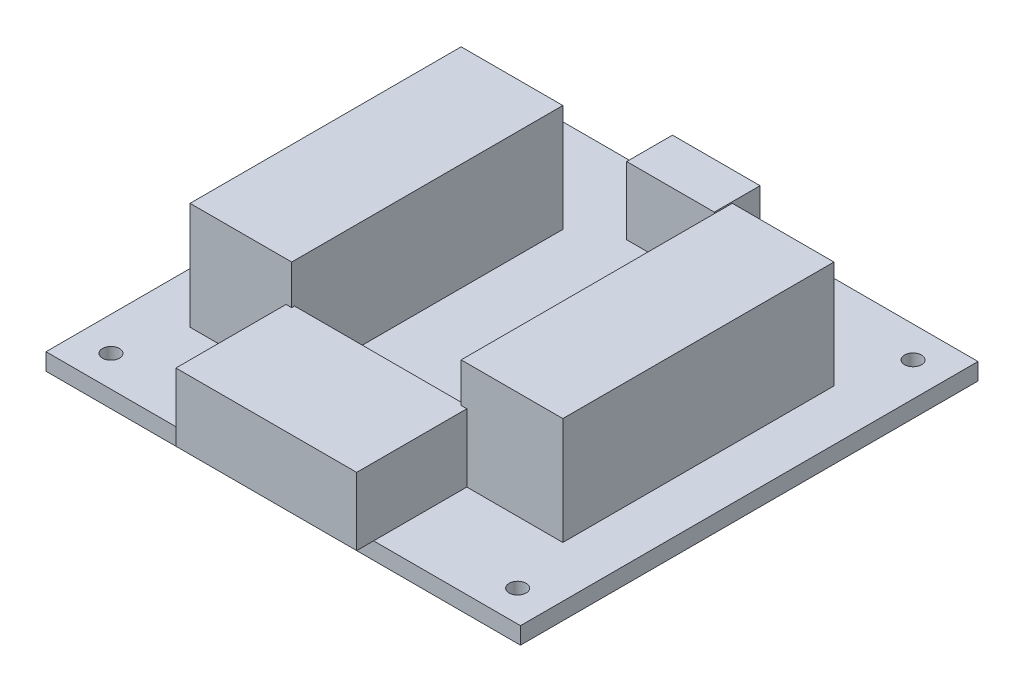
ISO-10303-21;
HEADER;
FILE_DESCRIPTION(('STEP AP214'),'2;1');
FILE_NAME('part.step','',(''),(''),'','','');
FILE_SCHEMA(('AUTOMOTIVE_DESIGN { 1 0 10303 214 1 1 1 1 }'));
ENDSEC;
DATA;
#1=APPLICATION_CONTEXT('core data for automotive mechanical design processes');
#2=APPLICATION_PROTOCOL_DEFINITION('international standard','automotive_design',2000,#1);
#3=PRODUCT_CONTEXT('',#1,'mechanical');
#4=PRODUCT('Part','Part','',(#3));
#5=PRODUCT_RELATED_PRODUCT_CATEGORY('part','',(#4));
#6=PRODUCT_DEFINITION_FORMATION('','',#4);
#7=PRODUCT_DEFINITION_CONTEXT('part definition',#1,'design');
#8=PRODUCT_DEFINITION('design','',#6,#7);
#9=PRODUCT_DEFINITION_SHAPE('','',#8);
#10=(LENGTH_UNIT() NAMED_UNIT(*) SI_UNIT(.MILLI.,.METRE.));
#11=(NAMED_UNIT(*) PLANE_ANGLE_UNIT() SI_UNIT($,.RADIAN.));
#12=(NAMED_UNIT(*) SI_UNIT($,.STERADIAN.) SOLID_ANGLE_UNIT());
#13=UNCERTAINTY_MEASURE_WITH_UNIT(LENGTH_MEASURE(1.E-05),#10,'distance_accuracy_value','');
#14=(GEOMETRIC_REPRESENTATION_CONTEXT(3) GLOBAL_UNCERTAINTY_ASSIGNED_CONTEXT((#13)) GLOBAL_UNIT_ASSIGNED_CONTEXT((#10,
#11,#12)) REPRESENTATION_CONTEXT('',''));
#15=CARTESIAN_POINT('',(0.,0.,0.));
#16=DIRECTION('',(0.,0.,1.));
#17=DIRECTION('',(1.,0.,0.));
#18=AXIS2_PLACEMENT_3D('',#15,#16,#17);
#19=CARTESIAN_POINT('',(0.,3.,0.));
#20=DIRECTION('',(0.,1.,0.));
#21=DIRECTION('',(0.,0.,1.));
#22=AXIS2_PLACEMENT_3D('',#19,#20,#21);
#23=PLANE('',#22);
#24=CARTESIAN_POINT('',(-36.,3.,35.));
#25=DIRECTION('',(0.,1.,0.));
#26=DIRECTION('',(0.,0.,1.));
#27=AXIS2_PLACEMENT_3D('',#24,#25,#26);
#28=CIRCLE('',#27,1.5);
#29=CARTESIAN_POINT('',(-36.,3.,36.5));
#30=VERTEX_POINT('',#29);
#31=EDGE_CURVE('E373',#30,#30,#28,.T.);
#32=ORIENTED_EDGE('',*,*,#31,.F.);
#33=EDGE_LOOP('',(#32));
#34=FACE_BOUND('',#33,.T.);
#35=CARTESIAN_POINT('',(36.,3.,-35.));
#36=DIRECTION('',(0.,1.,0.));
#37=DIRECTION('',(0.,0.,1.));
#38=AXIS2_PLACEMENT_3D('',#35,#36,#37);
#39=CIRCLE('',#38,1.5);
#40=CARTESIAN_POINT('',(36.,3.,-33.5));
#41=VERTEX_POINT('',#40);
#42=EDGE_CURVE('E363',#41,#41,#39,.T.);
#43=ORIENTED_EDGE('',*,*,#42,.F.);
#44=EDGE_LOOP('',(#43));
#45=FACE_BOUND('',#44,.T.);
#46=CARTESIAN_POINT('',(36.,3.,35.));
#47=DIRECTION('',(0.,1.,0.));
#48=DIRECTION('',(0.,0.,1.));
#49=AXIS2_PLACEMENT_3D('',#46,#47,#48);
#50=CIRCLE('',#49,1.5);
#51=CARTESIAN_POINT('',(36.,3.,36.5));
#52=VERTEX_POINT('',#51);
#53=EDGE_CURVE('E360',#52,#52,#50,.T.);
#54=ORIENTED_EDGE('',*,*,#53,.F.);
#55=EDGE_LOOP('',(#54));
#56=FACE_BOUND('',#55,.T.);
#57=CARTESIAN_POINT('',(-36.,3.,-35.));
#58=DIRECTION('',(0.,1.,0.));
#59=DIRECTION('',(0.,0.,1.));
#60=AXIS2_PLACEMENT_3D('',#57,#58,#59);
#61=CIRCLE('',#60,1.5);
#62=CARTESIAN_POINT('',(-36.,3.,-33.5));
#63=VERTEX_POINT('',#62);
#64=EDGE_CURVE('E357',#63,#63,#61,.T.);
#65=ORIENTED_EDGE('',*,*,#64,.F.);
#66=EDGE_LOOP('',(#65));
#67=FACE_BOUND('',#66,.T.);
#68=DIRECTION('',(1.,0.,0.));
#69=VECTOR('',#68,1.);
#70=CARTESIAN_POINT('',(33.,3.,24.));
#71=LINE('',#70,#69);
#72=CARTESIAN_POINT('',(16.,3.,24.));
#73=VERTEX_POINT('',#72);
#74=CARTESIAN_POINT('',(33.,3.,24.));
#75=VERTEX_POINT('',#74);
#76=EDGE_CURVE('E261',#73,#75,#71,.T.);
#77=ORIENTED_EDGE('',*,*,#76,.F.);
#78=DIRECTION('',(0.,0.,-1.));
#79=VECTOR('',#78,1.);
#80=CARTESIAN_POINT('',(16.,3.,23.5));
#81=LINE('',#80,#79);
#82=CARTESIAN_POINT('',(16.,3.,40.5));
#83=VERTEX_POINT('',#82);
#84=EDGE_CURVE('E214',#83,#73,#81,.T.);
#85=ORIENTED_EDGE('',*,*,#84,.F.);
#86=DIRECTION('',(1.,0.,0.));
#87=VECTOR('',#86,1.);
#88=CARTESIAN_POINT('',(-42.,3.,40.5));
#89=LINE('',#88,#87);
#90=CARTESIAN_POINT('',(42.,3.,40.5));
#91=VERTEX_POINT('',#90);
#92=EDGE_CURVE('E325',#83,#91,#89,.T.);
#93=ORIENTED_EDGE('',*,*,#92,.T.);
#94=DIRECTION('',(0.,0.,-1.));
#95=VECTOR('',#94,1.);
#96=CARTESIAN_POINT('',(42.,3.,-40.5));
#97=LINE('',#96,#95);
#98=CARTESIAN_POINT('',(42.,3.,-40.5));
#99=VERTEX_POINT('',#98);
#100=EDGE_CURVE('E317',#91,#99,#97,.T.);
#101=ORIENTED_EDGE('',*,*,#100,.T.);
#102=DIRECTION('',(-1.,0.,0.));
#103=VECTOR('',#102,1.);
#104=CARTESIAN_POINT('',(-42.,3.,-40.5));
#105=LINE('',#104,#103);
#106=CARTESIAN_POINT('',(-42.,3.,-40.5));
#107=VERTEX_POINT('',#106);
#108=EDGE_CURVE('E320',#99,#107,#105,.T.);
#109=ORIENTED_EDGE('',*,*,#108,.T.);
#110=DIRECTION('',(0.,0.,1.));
#111=VECTOR('',#110,1.);
#112=CARTESIAN_POINT('',(-42.,3.,-40.5));
#113=LINE('',#112,#111);
#114=CARTESIAN_POINT('',(-42.,3.,40.5));
#115=VERTEX_POINT('',#114);
#116=EDGE_CURVE('E323',#107,#115,#113,.T.);
#117=ORIENTED_EDGE('',*,*,#116,.T.);
#118=CARTESIAN_POINT('',(-16.,3.,40.5));
#119=VERTEX_POINT('',#118);
#120=EDGE_CURVE('E326',#115,#119,#89,.T.);
#121=ORIENTED_EDGE('',*,*,#120,.T.);
#122=DIRECTION('',(0.,0.,1.));
#123=VECTOR('',#122,1.);
#124=CARTESIAN_POINT('',(-16.,3.,23.5));
#125=LINE('',#124,#123);
#126=CARTESIAN_POINT('',(-16.,3.,24.));
#127=VERTEX_POINT('',#126);
#128=EDGE_CURVE('E236',#127,#119,#125,.T.);
#129=ORIENTED_EDGE('',*,*,#128,.F.);
#130=DIRECTION('',(1.,0.,0.));
#131=VECTOR('',#130,1.);
#132=CARTESIAN_POINT('',(-33.,3.,24.));
#133=LINE('',#132,#131);
#134=CARTESIAN_POINT('',(-33.,3.,24.));
#135=VERTEX_POINT('',#134);
#136=EDGE_CURVE('E291',#135,#127,#133,.T.);
#137=ORIENTED_EDGE('',*,*,#136,.F.);
#138=DIRECTION('',(0.,0.,1.));
#139=VECTOR('',#138,1.);
#140=CARTESIAN_POINT('',(-33.,3.,-24.));
#141=LINE('',#140,#139);
#142=CARTESIAN_POINT('',(-33.,3.,-24.));
#143=VERTEX_POINT('',#142);
#144=EDGE_CURVE('E301',#143,#135,#141,.T.);
#145=ORIENTED_EDGE('',*,*,#144,.F.);
#146=DIRECTION('',(-1.,0.,0.));
#147=VECTOR('',#146,1.);
#148=CARTESIAN_POINT('',(-33.,3.,-24.));
#149=LINE('',#148,#147);
#150=CARTESIAN_POINT('',(-15.,3.,-24.));
#151=VERTEX_POINT('',#150);
#152=EDGE_CURVE('E299',#151,#143,#149,.T.);
#153=ORIENTED_EDGE('',*,*,#152,.F.);
#154=DIRECTION('',(0.,0.,-1.));
#155=VECTOR('',#154,1.);
#156=CARTESIAN_POINT('',(-15.,3.,-24.));
#157=LINE('',#156,#155);
#158=CARTESIAN_POINT('',(-15.,3.,23.5));
#159=VERTEX_POINT('',#158);
#160=EDGE_CURVE('E286',#159,#151,#157,.T.);
#161=ORIENTED_EDGE('',*,*,#160,.F.);
#162=DIRECTION('',(-1.,0.,0.));
#163=VECTOR('',#162,1.);
#164=CARTESIAN_POINT('',(-16.,3.,23.5));
#165=LINE('',#164,#163);
#166=CARTESIAN_POINT('',(15.,3.,23.5));
#167=VERTEX_POINT('',#166);
#168=EDGE_CURVE('E232',#167,#159,#165,.T.);
#169=ORIENTED_EDGE('',*,*,#168,.F.);
#170=DIRECTION('',(0.,0.,1.));
#171=VECTOR('',#170,1.);
#172=CARTESIAN_POINT('',(15.,3.,-24.));
#173=LINE('',#172,#171);
#174=CARTESIAN_POINT('',(15.,3.,-24.));
#175=VERTEX_POINT('',#174);
#176=EDGE_CURVE('E272',#175,#167,#173,.T.);
#177=ORIENTED_EDGE('',*,*,#176,.F.);
#178=DIRECTION('',(-1.,0.,0.));
#179=VECTOR('',#178,1.);
#180=CARTESIAN_POINT('',(33.,3.,-24.));
#181=LINE('',#180,#179);
#182=CARTESIAN_POINT('',(33.,3.,-24.));
#183=VERTEX_POINT('',#182);
#184=EDGE_CURVE('E270',#183,#175,#181,.T.);
#185=ORIENTED_EDGE('',*,*,#184,.F.);
#186=DIRECTION('',(0.,0.,-1.));
#187=VECTOR('',#186,1.);
#188=CARTESIAN_POINT('',(33.,3.,-24.));
#189=LINE('',#188,#187);
#190=EDGE_CURVE('E256',#75,#183,#189,.T.);
#191=ORIENTED_EDGE('',*,*,#190,.F.);
#192=EDGE_LOOP('',(#77,#85,#93,#101,#109,#117,#121,#129,#137,#145,#153,#161,#169,#177,#185,#191));
#193=FACE_BOUND('',#192,.T.);
#194=DIRECTION('',(-1.,0.,0.));
#195=VECTOR('',#194,1.);
#196=CARTESIAN_POINT('',(-7.75353526251993,3.,-36.1638771572757));
#197=LINE('',#196,#195);
#198=CARTESIAN_POINT('',(7.75353526251993,3.,-36.1638771572757));
#199=VERTEX_POINT('',#198);
#200=CARTESIAN_POINT('',(-7.75353526251993,3.,-36.1638771572757));
#201=VERTEX_POINT('',#200);
#202=EDGE_CURVE('E382',#199,#201,#197,.T.);
#203=ORIENTED_EDGE('',*,*,#202,.F.);
#204=DIRECTION('',(0.,0.,-1.));
#205=VECTOR('',#204,1.);
#206=CARTESIAN_POINT('',(7.75353526251993,3.,-36.1638771572757));
#207=LINE('',#206,#205);
#208=CARTESIAN_POINT('',(7.75353526251993,3.,-28.063168674046));
#209=VERTEX_POINT('',#208);
#210=EDGE_CURVE('E212',#209,#199,#207,.T.);
#211=ORIENTED_EDGE('',*,*,#210,.F.);
#212=DIRECTION('',(1.,0.,0.));
#213=VECTOR('',#212,1.);
#214=CARTESIAN_POINT('',(-7.75353526251993,3.,-28.063168674046));
#215=LINE('',#214,#213);
#216=CARTESIAN_POINT('',(-7.75353526251993,3.,-28.063168674046));
#217=VERTEX_POINT('',#216);
#218=EDGE_CURVE('E208',#217,#209,#215,.T.);
#219=ORIENTED_EDGE('',*,*,#218,.F.);
#220=DIRECTION('',(0.,0.,1.));
#221=VECTOR('',#220,1.);
#222=CARTESIAN_POINT('',(-7.75353526251993,3.,-36.1638771572757));
#223=LINE('',#222,#221);
#224=EDGE_CURVE('E384',#201,#217,#223,.T.);
#225=ORIENTED_EDGE('',*,*,#224,.F.);
#226=EDGE_LOOP('',(#203,#211,#219,#225));
#227=FACE_BOUND('',#226,.T.);
#228=ADVANCED_FACE('F33',(#34,#45,#56,#67,#193,#227),#23,.T.);
#229=CARTESIAN_POINT('',(-15.,22.,-24.));
#230=DIRECTION('',(-1.,0.,0.));
#231=DIRECTION('',(0.,0.,1.));
#232=AXIS2_PLACEMENT_3D('',#229,#230,#231);
#233=PLANE('',#232);
#234=DIRECTION('',(0.,1.,0.));
#235=VECTOR('',#234,1.);
#236=CARTESIAN_POINT('',(-15.,22.,23.5));
#237=LINE('',#236,#235);
#238=CARTESIAN_POINT('',(-15.,15.,23.5));
#239=VERTEX_POINT('',#238);
#240=EDGE_CURVE('E254',#159,#239,#237,.T.);
#241=ORIENTED_EDGE('',*,*,#240,.F.);
#242=ORIENTED_EDGE('',*,*,#160,.T.);
#243=DIRECTION('',(0.,-1.,0.));
#244=VECTOR('',#243,1.);
#245=CARTESIAN_POINT('',(-15.,22.,-24.));
#246=LINE('',#245,#244);
#247=CARTESIAN_POINT('',(-15.,22.,-24.));
#248=VERTEX_POINT('',#247);
#249=EDGE_CURVE('E313',#248,#151,#246,.T.);
#250=ORIENTED_EDGE('',*,*,#249,.F.);
#251=DIRECTION('',(0.,0.,-1.));
#252=VECTOR('',#251,1.);
#253=CARTESIAN_POINT('',(-15.,22.,-24.));
#254=LINE('',#253,#252);
#255=CARTESIAN_POINT('',(-15.,22.,24.));
#256=VERTEX_POINT('',#255);
#257=EDGE_CURVE('E287',#256,#248,#254,.T.);
#258=ORIENTED_EDGE('',*,*,#257,.F.);
#259=DIRECTION('',(0.,-1.,0.));
#260=VECTOR('',#259,1.);
#261=CARTESIAN_POINT('',(-15.,22.,24.));
#262=LINE('',#261,#260);
#263=CARTESIAN_POINT('',(-15.,15.,24.));
#264=VERTEX_POINT('',#263);
#265=EDGE_CURVE('E297',#256,#264,#262,.T.);
#266=ORIENTED_EDGE('',*,*,#265,.T.);
#267=DIRECTION('',(0.,0.,-1.));
#268=VECTOR('',#267,1.);
#269=CARTESIAN_POINT('',(-15.,15.,-24.));
#270=LINE('',#269,#268);
#271=EDGE_CURVE('E251',#264,#239,#270,.T.);
#272=ORIENTED_EDGE('',*,*,#271,.T.);
#273=EDGE_LOOP('',(#241,#242,#250,#258,#266,#272));
#274=FACE_BOUND('',#273,.T.);
#275=ADVANCED_FACE('F403',(#274),#233,.F.);
#276=CARTESIAN_POINT('',(-33.,22.,24.));
#277=DIRECTION('',(0.,0.,-1.));
#278=DIRECTION('',(-1.,0.,0.));
#279=AXIS2_PLACEMENT_3D('',#276,#277,#278);
#280=PLANE('',#279);
#281=DIRECTION('',(0.,-1.,0.));
#282=VECTOR('',#281,1.);
#283=CARTESIAN_POINT('',(-16.,22.,24.));
#284=LINE('',#283,#282);
#285=CARTESIAN_POINT('',(-16.,15.,24.));
#286=VERTEX_POINT('',#285);
#287=EDGE_CURVE('E11',#286,#127,#284,.T.);
#288=ORIENTED_EDGE('',*,*,#287,.F.);
#289=DIRECTION('',(1.,0.,0.));
#290=VECTOR('',#289,1.);
#291=CARTESIAN_POINT('',(-33.,15.,24.));
#292=LINE('',#291,#290);
#293=EDGE_CURVE('E248',#286,#264,#292,.T.);
#294=ORIENTED_EDGE('',*,*,#293,.T.);
#295=ORIENTED_EDGE('',*,*,#265,.F.);
#296=DIRECTION('',(1.,0.,0.));
#297=VECTOR('',#296,1.);
#298=CARTESIAN_POINT('',(-33.,22.,24.));
#299=LINE('',#298,#297);
#300=CARTESIAN_POINT('',(-33.,22.,24.));
#301=VERTEX_POINT('',#300);
#302=EDGE_CURVE('E295',#301,#256,#299,.T.);
#303=ORIENTED_EDGE('',*,*,#302,.F.);
#304=DIRECTION('',(0.,-1.,0.));
#305=VECTOR('',#304,1.);
#306=CARTESIAN_POINT('',(-33.,22.,24.));
#307=LINE('',#306,#305);
#308=EDGE_CURVE('E308',#301,#135,#307,.T.);
#309=ORIENTED_EDGE('',*,*,#308,.T.);
#310=ORIENTED_EDGE('',*,*,#136,.T.);
#311=EDGE_LOOP('',(#288,#294,#295,#303,#309,#310));
#312=FACE_BOUND('',#311,.T.);
#313=ADVANCED_FACE('F409',(#312),#280,.F.);
#314=CARTESIAN_POINT('',(15.,22.,-24.));
#315=DIRECTION('',(1.,0.,0.));
#316=DIRECTION('',(0.,0.,-1.));
#317=AXIS2_PLACEMENT_3D('',#314,#315,#316);
#318=PLANE('',#317);
#319=DIRECTION('',(0.,-1.,0.));
#320=VECTOR('',#319,1.);
#321=CARTESIAN_POINT('',(15.,22.,23.5));
#322=LINE('',#321,#320);
#323=CARTESIAN_POINT('',(15.,15.,23.5));
#324=VERTEX_POINT('',#323);
#325=EDGE_CURVE('E42',#324,#167,#322,.T.);
#326=ORIENTED_EDGE('',*,*,#325,.F.);
#327=DIRECTION('',(0.,0.,1.));
#328=VECTOR('',#327,1.);
#329=CARTESIAN_POINT('',(15.,15.,-24.));
#330=LINE('',#329,#328);
#331=CARTESIAN_POINT('',(15.,15.,24.));
#332=VERTEX_POINT('',#331);
#333=EDGE_CURVE('E245',#324,#332,#330,.T.);
#334=ORIENTED_EDGE('',*,*,#333,.T.);
#335=DIRECTION('',(0.,-1.,0.));
#336=VECTOR('',#335,1.);
#337=CARTESIAN_POINT('',(15.,22.,24.));
#338=LINE('',#337,#336);
#339=CARTESIAN_POINT('',(15.,22.,24.));
#340=VERTEX_POINT('',#339);
#341=EDGE_CURVE('E278',#340,#332,#338,.T.);
#342=ORIENTED_EDGE('',*,*,#341,.F.);
#343=DIRECTION('',(0.,0.,1.));
#344=VECTOR('',#343,1.);
#345=CARTESIAN_POINT('',(15.,22.,-24.));
#346=LINE('',#345,#344);
#347=CARTESIAN_POINT('',(15.,22.,-24.));
#348=VERTEX_POINT('',#347);
#349=EDGE_CURVE('E263',#348,#340,#346,.T.);
#350=ORIENTED_EDGE('',*,*,#349,.F.);
#351=DIRECTION('',(0.,-1.,0.));
#352=VECTOR('',#351,1.);
#353=CARTESIAN_POINT('',(15.,22.,-24.));
#354=LINE('',#353,#352);
#355=EDGE_CURVE('E281',#348,#175,#354,.T.);
#356=ORIENTED_EDGE('',*,*,#355,.T.);
#357=ORIENTED_EDGE('',*,*,#176,.T.);
#358=EDGE_LOOP('',(#326,#334,#342,#350,#356,#357));
#359=FACE_BOUND('',#358,.T.);
#360=ADVANCED_FACE('F482',(#359),#318,.F.);
#361=CARTESIAN_POINT('',(33.,22.,24.));
#362=DIRECTION('',(0.,0.,-1.));
#363=DIRECTION('',(-1.,0.,0.));
#364=AXIS2_PLACEMENT_3D('',#361,#362,#363);
#365=PLANE('',#364);
#366=DIRECTION('',(0.,1.,0.));
#367=VECTOR('',#366,1.);
#368=CARTESIAN_POINT('',(16.,22.,24.));
#369=LINE('',#368,#367);
#370=CARTESIAN_POINT('',(16.,15.,24.));
#371=VERTEX_POINT('',#370);
#372=EDGE_CURVE('E351',#73,#371,#369,.T.);
#373=ORIENTED_EDGE('',*,*,#372,.F.);
#374=ORIENTED_EDGE('',*,*,#76,.T.);
#375=DIRECTION('',(0.,-1.,0.));
#376=VECTOR('',#375,1.);
#377=CARTESIAN_POINT('',(33.,22.,24.));
#378=LINE('',#377,#376);
#379=CARTESIAN_POINT('',(33.,22.,24.));
#380=VERTEX_POINT('',#379);
#381=EDGE_CURVE('E267',#380,#75,#378,.T.);
#382=ORIENTED_EDGE('',*,*,#381,.F.);
#383=DIRECTION('',(1.,0.,0.));
#384=VECTOR('',#383,1.);
#385=CARTESIAN_POINT('',(33.,22.,24.));
#386=LINE('',#385,#384);
#387=EDGE_CURVE('E265',#340,#380,#386,.T.);
#388=ORIENTED_EDGE('',*,*,#387,.F.);
#389=ORIENTED_EDGE('',*,*,#341,.T.);
#390=DIRECTION('',(1.,0.,0.));
#391=VECTOR('',#390,1.);
#392=CARTESIAN_POINT('',(33.,15.,24.));
#393=LINE('',#392,#391);
#394=EDGE_CURVE('E348',#332,#371,#393,.T.);
#395=ORIENTED_EDGE('',*,*,#394,.T.);
#396=EDGE_LOOP('',(#373,#374,#382,#388,#389,#395));
#397=FACE_BOUND('',#396,.T.);
#398=ADVANCED_FACE('F434',(#397),#365,.F.);
#399=CARTESIAN_POINT('',(42.,3.,-40.5));
#400=DIRECTION('',(-1.,0.,0.));
#401=DIRECTION('',(0.,0.,1.));
#402=AXIS2_PLACEMENT_3D('',#399,#400,#401);
#403=PLANE('',#402);
#404=DIRECTION('',(0.,0.,-1.));
#405=VECTOR('',#404,1.);
#406=CARTESIAN_POINT('',(42.,0.,-40.5));
#407=LINE('',#406,#405);
#408=CARTESIAN_POINT('',(42.,0.,40.5));
#409=VERTEX_POINT('',#408);
#410=CARTESIAN_POINT('',(42.,0.,-40.5));
#411=VERTEX_POINT('',#410);
#412=EDGE_CURVE('E316',#409,#411,#407,.T.);
#413=ORIENTED_EDGE('',*,*,#412,.T.);
#414=DIRECTION('',(0.,-1.,0.));
#415=VECTOR('',#414,1.);
#416=CARTESIAN_POINT('',(42.,3.,-40.5));
#417=LINE('',#416,#415);
#418=EDGE_CURVE('E345',#99,#411,#417,.T.);
#419=ORIENTED_EDGE('',*,*,#418,.F.);
#420=ORIENTED_EDGE('',*,*,#100,.F.);
#421=DIRECTION('',(0.,-1.,0.));
#422=VECTOR('',#421,1.);
#423=CARTESIAN_POINT('',(42.,3.,40.5));
#424=LINE('',#423,#422);
#425=EDGE_CURVE('E329',#91,#409,#424,.T.);
#426=ORIENTED_EDGE('',*,*,#425,.T.);
#427=EDGE_LOOP('',(#413,#419,#420,#426));
#428=FACE_BOUND('',#427,.T.);
#429=ADVANCED_FACE('F35',(#428),#403,.F.);
#430=CARTESIAN_POINT('',(-42.,3.,-40.5));
#431=DIRECTION('',(0.,0.,1.));
#432=DIRECTION('',(1.,0.,0.));
#433=AXIS2_PLACEMENT_3D('',#430,#431,#432);
#434=PLANE('',#433);
#435=DIRECTION('',(-1.,0.,0.));
#436=VECTOR('',#435,1.);
#437=CARTESIAN_POINT('',(-42.,0.,-40.5));
#438=LINE('',#437,#436);
#439=CARTESIAN_POINT('',(-42.,0.,-40.5));
#440=VERTEX_POINT('',#439);
#441=EDGE_CURVE('E332',#411,#440,#438,.T.);
#442=ORIENTED_EDGE('',*,*,#441,.T.);
#443=DIRECTION('',(0.,-1.,0.));
#444=VECTOR('',#443,1.);
#445=CARTESIAN_POINT('',(-42.,3.,-40.5));
#446=LINE('',#445,#444);
#447=EDGE_CURVE('E342',#107,#440,#446,.T.);
#448=ORIENTED_EDGE('',*,*,#447,.F.);
#449=ORIENTED_EDGE('',*,*,#108,.F.);
#450=ORIENTED_EDGE('',*,*,#418,.T.);
#451=EDGE_LOOP('',(#442,#448,#449,#450));
#452=FACE_BOUND('',#451,.T.);
#453=ADVANCED_FACE('F427',(#452),#434,.F.);
#454=CARTESIAN_POINT('',(-42.,3.,-40.5));
#455=DIRECTION('',(1.,0.,0.));
#456=DIRECTION('',(0.,0.,-1.));
#457=AXIS2_PLACEMENT_3D('',#454,#455,#456);
#458=PLANE('',#457);
#459=DIRECTION('',(0.,0.,1.));
#460=VECTOR('',#459,1.);
#461=CARTESIAN_POINT('',(-42.,0.,-40.5));
#462=LINE('',#461,#460);
#463=CARTESIAN_POINT('',(-42.,0.,40.5));
#464=VERTEX_POINT('',#463);
#465=EDGE_CURVE('E334',#440,#464,#462,.T.);
#466=ORIENTED_EDGE('',*,*,#465,.T.);
#467=DIRECTION('',(0.,-1.,0.));
#468=VECTOR('',#467,1.);
#469=CARTESIAN_POINT('',(-42.,3.,40.5));
#470=LINE('',#469,#468);
#471=EDGE_CURVE('E339',#115,#464,#470,.T.);
#472=ORIENTED_EDGE('',*,*,#471,.F.);
#473=ORIENTED_EDGE('',*,*,#116,.F.);
#474=ORIENTED_EDGE('',*,*,#447,.T.);
#475=EDGE_LOOP('',(#466,#472,#473,#474));
#476=FACE_BOUND('',#475,.T.);
#477=ADVANCED_FACE('F424',(#476),#458,.F.);
#478=CARTESIAN_POINT('',(-42.,3.,40.5));
#479=DIRECTION('',(0.,0.,-1.));
#480=DIRECTION('',(-1.,0.,0.));
#481=AXIS2_PLACEMENT_3D('',#478,#479,#480);
#482=PLANE('',#481);
#483=DIRECTION('',(1.,0.,0.));
#484=VECTOR('',#483,1.);
#485=CARTESIAN_POINT('',(-42.,0.,40.5));
#486=LINE('',#485,#484);
#487=EDGE_CURVE('E321',#464,#409,#486,.T.);
#488=ORIENTED_EDGE('',*,*,#487,.T.);
#489=ORIENTED_EDGE('',*,*,#425,.F.);
#490=ORIENTED_EDGE('',*,*,#92,.F.);
#491=DIRECTION('',(1.,0.,0.));
#492=VECTOR('',#491,1.);
#493=CARTESIAN_POINT('',(-42.,3.,40.5));
#494=LINE('',#493,#492);
#495=EDGE_CURVE('E243',#119,#83,#494,.T.);
#496=ORIENTED_EDGE('',*,*,#495,.F.);
#497=ORIENTED_EDGE('',*,*,#120,.F.);
#498=ORIENTED_EDGE('',*,*,#471,.T.);
#499=EDGE_LOOP('',(#488,#489,#490,#496,#497,#498));
#500=FACE_BOUND('',#499,.T.);
#501=ADVANCED_FACE('F420',(#500),#482,.F.);
#502=CARTESIAN_POINT('',(0.,0.,0.));
#503=DIRECTION('',(0.,1.,0.));
#504=DIRECTION('',(0.,0.,1.));
#505=AXIS2_PLACEMENT_3D('',#502,#503,#504);
#506=PLANE('',#505);
#507=CARTESIAN_POINT('',(-36.,0.,35.));
#508=DIRECTION('',(0.,1.,0.));
#509=DIRECTION('',(0.,0.,1.));
#510=AXIS2_PLACEMENT_3D('',#507,#508,#509);
#511=CIRCLE('',#510,1.5);
#512=CARTESIAN_POINT('',(-36.,0.,36.5));
#513=VERTEX_POINT('',#512);
#514=EDGE_CURVE('E37',#513,#513,#511,.T.);
#515=ORIENTED_EDGE('',*,*,#514,.T.);
#516=EDGE_LOOP('',(#515));
#517=FACE_BOUND('',#516,.T.);
#518=CARTESIAN_POINT('',(36.,0.,-35.));
#519=DIRECTION('',(0.,1.,0.));
#520=DIRECTION('',(0.,0.,1.));
#521=AXIS2_PLACEMENT_3D('',#518,#519,#520);
#522=CIRCLE('',#521,1.5);
#523=CARTESIAN_POINT('',(36.,0.,-33.5));
#524=VERTEX_POINT('',#523);
#525=EDGE_CURVE('E361',#524,#524,#522,.T.);
#526=ORIENTED_EDGE('',*,*,#525,.T.);
#527=EDGE_LOOP('',(#526));
#528=FACE_BOUND('',#527,.T.);
#529=CARTESIAN_POINT('',(36.,0.,35.));
#530=DIRECTION('',(0.,1.,0.));
#531=DIRECTION('',(0.,0.,1.));
#532=AXIS2_PLACEMENT_3D('',#529,#530,#531);
#533=CIRCLE('',#532,1.5);
#534=CARTESIAN_POINT('',(36.,0.,36.5));
#535=VERTEX_POINT('',#534);
#536=EDGE_CURVE('E358',#535,#535,#533,.T.);
#537=ORIENTED_EDGE('',*,*,#536,.T.);
#538=EDGE_LOOP('',(#537));
#539=FACE_BOUND('',#538,.T.);
#540=CARTESIAN_POINT('',(-36.,0.,-35.));
#541=DIRECTION('',(0.,1.,0.));
#542=DIRECTION('',(0.,0.,1.));
#543=AXIS2_PLACEMENT_3D('',#540,#541,#542);
#544=CIRCLE('',#543,1.5);
#545=CARTESIAN_POINT('',(-36.,0.,-33.5));
#546=VERTEX_POINT('',#545);
#547=EDGE_CURVE('E354',#546,#546,#544,.T.);
#548=ORIENTED_EDGE('',*,*,#547,.T.);
#549=EDGE_LOOP('',(#548));
#550=FACE_BOUND('',#549,.T.);
#551=ORIENTED_EDGE('',*,*,#412,.F.);
#552=ORIENTED_EDGE('',*,*,#487,.F.);
#553=ORIENTED_EDGE('',*,*,#465,.F.);
#554=ORIENTED_EDGE('',*,*,#441,.F.);
#555=EDGE_LOOP('',(#551,#552,#553,#554));
#556=FACE_BOUND('',#555,.T.);
#557=ADVANCED_FACE('F416',(#517,#528,#539,#550,#556),#506,.F.);
#558=CARTESIAN_POINT('',(-33.,22.,-24.));
#559=DIRECTION('',(0.,0.,1.));
#560=DIRECTION('',(1.,0.,0.));
#561=AXIS2_PLACEMENT_3D('',#558,#559,#560);
#562=PLANE('',#561);
#563=ORIENTED_EDGE('',*,*,#152,.T.);
#564=DIRECTION('',(0.,-1.,0.));
#565=VECTOR('',#564,1.);
#566=CARTESIAN_POINT('',(-33.,22.,-24.));
#567=LINE('',#566,#565);
#568=CARTESIAN_POINT('',(-33.,22.,-24.));
#569=VERTEX_POINT('',#568);
#570=EDGE_CURVE('E310',#569,#143,#567,.T.);
#571=ORIENTED_EDGE('',*,*,#570,.F.);
#572=DIRECTION('',(-1.,0.,0.));
#573=VECTOR('',#572,1.);
#574=CARTESIAN_POINT('',(-33.,22.,-24.));
#575=LINE('',#574,#573);
#576=EDGE_CURVE('E290',#248,#569,#575,.T.);
#577=ORIENTED_EDGE('',*,*,#576,.F.);
#578=ORIENTED_EDGE('',*,*,#249,.T.);
#579=EDGE_LOOP('',(#563,#571,#577,#578));
#580=FACE_BOUND('',#579,.T.);
#581=ADVANCED_FACE('F419',(#580),#562,.F.);
#582=CARTESIAN_POINT('',(-33.,22.,-24.));
#583=DIRECTION('',(1.,0.,0.));
#584=DIRECTION('',(0.,0.,-1.));
#585=AXIS2_PLACEMENT_3D('',#582,#583,#584);
#586=PLANE('',#585);
#587=ORIENTED_EDGE('',*,*,#144,.T.);
#588=ORIENTED_EDGE('',*,*,#308,.F.);
#589=DIRECTION('',(0.,0.,1.));
#590=VECTOR('',#589,1.);
#591=CARTESIAN_POINT('',(-33.,22.,-24.));
#592=LINE('',#591,#590);
#593=EDGE_CURVE('E293',#569,#301,#592,.T.);
#594=ORIENTED_EDGE('',*,*,#593,.F.);
#595=ORIENTED_EDGE('',*,*,#570,.T.);
#596=EDGE_LOOP('',(#587,#588,#594,#595));
#597=FACE_BOUND('',#596,.T.);
#598=ADVANCED_FACE('F466',(#597),#586,.F.);
#599=CARTESIAN_POINT('',(0.,22.,0.));
#600=DIRECTION('',(0.,1.,0.));
#601=DIRECTION('',(0.,0.,1.));
#602=AXIS2_PLACEMENT_3D('',#599,#600,#601);
#603=PLANE('',#602);
#604=ORIENTED_EDGE('',*,*,#257,.T.);
#605=ORIENTED_EDGE('',*,*,#576,.T.);
#606=ORIENTED_EDGE('',*,*,#593,.T.);
#607=ORIENTED_EDGE('',*,*,#302,.T.);
#608=EDGE_LOOP('',(#604,#605,#606,#607));
#609=FACE_BOUND('',#608,.T.);
#610=ADVANCED_FACE('F501',(#609),#603,.T.);
#611=CARTESIAN_POINT('',(33.,22.,-24.));
#612=DIRECTION('',(-1.,0.,0.));
#613=DIRECTION('',(0.,0.,1.));
#614=AXIS2_PLACEMENT_3D('',#611,#612,#613);
#615=PLANE('',#614);
#616=ORIENTED_EDGE('',*,*,#190,.T.);
#617=DIRECTION('',(0.,-1.,0.));
#618=VECTOR('',#617,1.);
#619=CARTESIAN_POINT('',(33.,22.,-24.));
#620=LINE('',#619,#618);
#621=CARTESIAN_POINT('',(33.,22.,-24.));
#622=VERTEX_POINT('',#621);
#623=EDGE_CURVE('E284',#622,#183,#620,.T.);
#624=ORIENTED_EDGE('',*,*,#623,.F.);
#625=DIRECTION('',(0.,0.,-1.));
#626=VECTOR('',#625,1.);
#627=CARTESIAN_POINT('',(33.,22.,-24.));
#628=LINE('',#627,#626);
#629=EDGE_CURVE('E257',#380,#622,#628,.T.);
#630=ORIENTED_EDGE('',*,*,#629,.F.);
#631=ORIENTED_EDGE('',*,*,#381,.T.);
#632=EDGE_LOOP('',(#616,#624,#630,#631));
#633=FACE_BOUND('',#632,.T.);
#634=ADVANCED_FACE('F499',(#633),#615,.F.);
#635=CARTESIAN_POINT('',(33.,22.,-24.));
#636=DIRECTION('',(0.,0.,1.));
#637=DIRECTION('',(1.,0.,0.));
#638=AXIS2_PLACEMENT_3D('',#635,#636,#637);
#639=PLANE('',#638);
#640=ORIENTED_EDGE('',*,*,#184,.T.);
#641=ORIENTED_EDGE('',*,*,#355,.F.);
#642=DIRECTION('',(-1.,0.,0.));
#643=VECTOR('',#642,1.);
#644=CARTESIAN_POINT('',(33.,22.,-24.));
#645=LINE('',#644,#643);
#646=EDGE_CURVE('E260',#622,#348,#645,.T.);
#647=ORIENTED_EDGE('',*,*,#646,.F.);
#648=ORIENTED_EDGE('',*,*,#623,.T.);
#649=EDGE_LOOP('',(#640,#641,#647,#648));
#650=FACE_BOUND('',#649,.T.);
#651=ADVANCED_FACE('F497',(#650),#639,.F.);
#652=CARTESIAN_POINT('',(0.,22.,0.));
#653=DIRECTION('',(0.,-1.,0.));
#654=DIRECTION('',(0.,0.,-1.));
#655=AXIS2_PLACEMENT_3D('',#652,#653,#654);
#656=PLANE('',#655);
#657=ORIENTED_EDGE('',*,*,#629,.T.);
#658=ORIENTED_EDGE('',*,*,#646,.T.);
#659=ORIENTED_EDGE('',*,*,#349,.T.);
#660=ORIENTED_EDGE('',*,*,#387,.T.);
#661=EDGE_LOOP('',(#657,#658,#659,#660));
#662=FACE_BOUND('',#661,.T.);
#663=ADVANCED_FACE('F490',(#662),#656,.F.);
#664=CARTESIAN_POINT('',(-16.,15.,23.5));
#665=DIRECTION('',(1.,0.,0.));
#666=DIRECTION('',(0.,0.,-1.));
#667=AXIS2_PLACEMENT_3D('',#664,#665,#666);
#668=PLANE('',#667);
#669=DIRECTION('',(0.,0.,1.));
#670=VECTOR('',#669,1.);
#671=CARTESIAN_POINT('',(-16.,15.,23.5));
#672=LINE('',#671,#670);
#673=CARTESIAN_POINT('',(-16.,15.,43.5));
#674=VERTEX_POINT('',#673);
#675=EDGE_CURVE('E226',#286,#674,#672,.T.);
#676=ORIENTED_EDGE('',*,*,#675,.F.);
#677=ORIENTED_EDGE('',*,*,#287,.T.);
#678=ORIENTED_EDGE('',*,*,#128,.T.);
#679=CARTESIAN_POINT('',(-16.,3.,43.5));
#680=VERTEX_POINT('',#679);
#681=EDGE_CURVE('E234',#119,#680,#125,.T.);
#682=ORIENTED_EDGE('',*,*,#681,.T.);
#683=DIRECTION('',(0.,-1.,0.));
#684=VECTOR('',#683,1.);
#685=CARTESIAN_POINT('',(-16.,15.,43.5));
#686=LINE('',#685,#684);
#687=EDGE_CURVE('E240',#674,#680,#686,.T.);
#688=ORIENTED_EDGE('',*,*,#687,.F.);
#689=EDGE_LOOP('',(#676,#677,#678,#682,#688));
#690=FACE_BOUND('',#689,.T.);
#691=ADVANCED_FACE('F548',(#690),#668,.F.);
#692=CARTESIAN_POINT('',(-16.,15.,23.5));
#693=DIRECTION('',(0.,0.,1.));
#694=DIRECTION('',(1.,0.,0.));
#695=AXIS2_PLACEMENT_3D('',#692,#693,#694);
#696=PLANE('',#695);
#697=ORIENTED_EDGE('',*,*,#168,.T.);
#698=ORIENTED_EDGE('',*,*,#240,.T.);
#699=DIRECTION('',(-1.,0.,0.));
#700=VECTOR('',#699,1.);
#701=CARTESIAN_POINT('',(-16.,15.,23.5));
#702=LINE('',#701,#700);
#703=EDGE_CURVE('E222',#324,#239,#702,.T.);
#704=ORIENTED_EDGE('',*,*,#703,.F.);
#705=ORIENTED_EDGE('',*,*,#325,.T.);
#706=EDGE_LOOP('',(#697,#698,#704,#705));
#707=FACE_BOUND('',#706,.T.);
#708=ADVANCED_FACE('F477',(#707),#696,.F.);
#709=CARTESIAN_POINT('',(16.,15.,23.5));
#710=DIRECTION('',(-1.,0.,0.));
#711=DIRECTION('',(0.,0.,1.));
#712=AXIS2_PLACEMENT_3D('',#709,#710,#711);
#713=PLANE('',#712);
#714=ORIENTED_EDGE('',*,*,#84,.T.);
#715=ORIENTED_EDGE('',*,*,#372,.T.);
#716=DIRECTION('',(0.,0.,-1.));
#717=VECTOR('',#716,1.);
#718=CARTESIAN_POINT('',(16.,15.,23.5));
#719=LINE('',#718,#717);
#720=CARTESIAN_POINT('',(16.,15.,43.5));
#721=VERTEX_POINT('',#720);
#722=EDGE_CURVE('E58',#721,#371,#719,.T.);
#723=ORIENTED_EDGE('',*,*,#722,.F.);
#724=DIRECTION('',(0.,-1.,0.));
#725=VECTOR('',#724,1.);
#726=CARTESIAN_POINT('',(16.,15.,43.5));
#727=LINE('',#726,#725);
#728=CARTESIAN_POINT('',(16.,3.,43.5));
#729=VERTEX_POINT('',#728);
#730=EDGE_CURVE('E229',#721,#729,#727,.T.);
#731=ORIENTED_EDGE('',*,*,#730,.T.);
#732=EDGE_CURVE('E216',#729,#83,#81,.T.);
#733=ORIENTED_EDGE('',*,*,#732,.T.);
#734=EDGE_LOOP('',(#714,#715,#723,#731,#733));
#735=FACE_BOUND('',#734,.T.);
#736=ADVANCED_FACE('F601',(#735),#713,.F.);
#737=CARTESIAN_POINT('',(0.,15.,0.));
#738=DIRECTION('',(0.,1.,0.));
#739=DIRECTION('',(0.,0.,1.));
#740=AXIS2_PLACEMENT_3D('',#737,#738,#739);
#741=PLANE('',#740);
#742=ORIENTED_EDGE('',*,*,#271,.F.);
#743=ORIENTED_EDGE('',*,*,#293,.F.);
#744=ORIENTED_EDGE('',*,*,#675,.T.);
#745=DIRECTION('',(1.,0.,0.));
#746=VECTOR('',#745,1.);
#747=CARTESIAN_POINT('',(-16.,15.,43.5));
#748=LINE('',#747,#746);
#749=EDGE_CURVE('E228',#674,#721,#748,.T.);
#750=ORIENTED_EDGE('',*,*,#749,.T.);
#751=ORIENTED_EDGE('',*,*,#722,.T.);
#752=ORIENTED_EDGE('',*,*,#394,.F.);
#753=ORIENTED_EDGE('',*,*,#333,.F.);
#754=ORIENTED_EDGE('',*,*,#703,.T.);
#755=EDGE_LOOP('',(#742,#743,#744,#750,#751,#752,#753,#754));
#756=FACE_BOUND('',#755,.T.);
#757=ADVANCED_FACE('F479',(#756),#741,.T.);
#758=CARTESIAN_POINT('',(0.,3.,0.));
#759=DIRECTION('',(0.,1.,0.));
#760=DIRECTION('',(0.,0.,1.));
#761=AXIS2_PLACEMENT_3D('',#758,#759,#760);
#762=PLANE('',#761);
#763=ORIENTED_EDGE('',*,*,#681,.F.);
#764=ORIENTED_EDGE('',*,*,#495,.T.);
#765=ORIENTED_EDGE('',*,*,#732,.F.);
#766=DIRECTION('',(1.,0.,0.));
#767=VECTOR('',#766,1.);
#768=CARTESIAN_POINT('',(-16.,3.,43.5));
#769=LINE('',#768,#767);
#770=EDGE_CURVE('E223',#680,#729,#769,.T.);
#771=ORIENTED_EDGE('',*,*,#770,.F.);
#772=EDGE_LOOP('',(#763,#764,#765,#771));
#773=FACE_BOUND('',#772,.T.);
#774=ADVANCED_FACE('F619',(#773),#762,.F.);
#775=CARTESIAN_POINT('',(-16.,15.,43.5));
#776=DIRECTION('',(0.,0.,-1.));
#777=DIRECTION('',(-1.,0.,0.));
#778=AXIS2_PLACEMENT_3D('',#775,#776,#777);
#779=PLANE('',#778);
#780=ORIENTED_EDGE('',*,*,#770,.T.);
#781=ORIENTED_EDGE('',*,*,#730,.F.);
#782=ORIENTED_EDGE('',*,*,#749,.F.);
#783=ORIENTED_EDGE('',*,*,#687,.T.);
#784=EDGE_LOOP('',(#780,#781,#782,#783));
#785=FACE_BOUND('',#784,.T.);
#786=ADVANCED_FACE('F628',(#785),#779,.F.);
#787=CARTESIAN_POINT('',(7.75353526251993,15.,-36.1638771572757));
#788=DIRECTION('',(-1.,0.,0.));
#789=DIRECTION('',(0.,0.,1.));
#790=AXIS2_PLACEMENT_3D('',#787,#788,#789);
#791=PLANE('',#790);
#792=ORIENTED_EDGE('',*,*,#210,.T.);
#793=DIRECTION('',(0.,-1.,0.));
#794=VECTOR('',#793,1.);
#795=CARTESIAN_POINT('',(7.75353526251993,15.,-36.1638771572757));
#796=LINE('',#795,#794);
#797=CARTESIAN_POINT('',(7.75353526251993,15.,-36.1638771572757));
#798=VERTEX_POINT('',#797);
#799=EDGE_CURVE('E193',#798,#199,#796,.T.);
#800=ORIENTED_EDGE('',*,*,#799,.F.);
#801=DIRECTION('',(0.,0.,-1.));
#802=VECTOR('',#801,1.);
#803=CARTESIAN_POINT('',(7.75353526251993,15.,-36.1638771572757));
#804=LINE('',#803,#802);
#805=CARTESIAN_POINT('',(7.75353526251993,15.,-28.063168674046));
#806=VERTEX_POINT('',#805);
#807=EDGE_CURVE('E200',#806,#798,#804,.T.);
#808=ORIENTED_EDGE('',*,*,#807,.F.);
#809=DIRECTION('',(0.,-1.,0.));
#810=VECTOR('',#809,1.);
#811=CARTESIAN_POINT('',(7.75353526251993,15.,-28.063168674046));
#812=LINE('',#811,#810);
#813=EDGE_CURVE('E380',#806,#209,#812,.T.);
#814=ORIENTED_EDGE('',*,*,#813,.T.);
#815=EDGE_LOOP('',(#792,#800,#808,#814));
#816=FACE_BOUND('',#815,.T.);
#817=ADVANCED_FACE('F210',(#816),#791,.F.);
#818=CARTESIAN_POINT('',(-7.75353526251993,15.,-36.1638771572757));
#819=DIRECTION('',(0.,0.,1.));
#820=DIRECTION('',(1.,0.,0.));
#821=AXIS2_PLACEMENT_3D('',#818,#819,#820);
#822=PLANE('',#821);
#823=ORIENTED_EDGE('',*,*,#202,.T.);
#824=DIRECTION('',(0.,-1.,0.));
#825=VECTOR('',#824,1.);
#826=CARTESIAN_POINT('',(-7.75353526251993,15.,-36.1638771572757));
#827=LINE('',#826,#825);
#828=CARTESIAN_POINT('',(-7.75353526251993,15.,-36.1638771572757));
#829=VERTEX_POINT('',#828);
#830=EDGE_CURVE('E196',#829,#201,#827,.T.);
#831=ORIENTED_EDGE('',*,*,#830,.F.);
#832=DIRECTION('',(-1.,0.,0.));
#833=VECTOR('',#832,1.);
#834=CARTESIAN_POINT('',(-7.75353526251993,15.,-36.1638771572757));
#835=LINE('',#834,#833);
#836=EDGE_CURVE('E189',#798,#829,#835,.T.);
#837=ORIENTED_EDGE('',*,*,#836,.F.);
#838=ORIENTED_EDGE('',*,*,#799,.T.);
#839=EDGE_LOOP('',(#823,#831,#837,#838));
#840=FACE_BOUND('',#839,.T.);
#841=ADVANCED_FACE('F191',(#840),#822,.F.);
#842=CARTESIAN_POINT('',(-7.75353526251993,15.,-36.1638771572757));
#843=DIRECTION('',(1.,0.,0.));
#844=DIRECTION('',(0.,0.,-1.));
#845=AXIS2_PLACEMENT_3D('',#842,#843,#844);
#846=PLANE('',#845);
#847=ORIENTED_EDGE('',*,*,#224,.T.);
#848=DIRECTION('',(0.,-1.,0.));
#849=VECTOR('',#848,1.);
#850=CARTESIAN_POINT('',(-7.75353526251993,15.,-28.063168674046));
#851=LINE('',#850,#849);
#852=CARTESIAN_POINT('',(-7.75353526251993,15.,-28.063168674046));
#853=VERTEX_POINT('',#852);
#854=EDGE_CURVE('E50',#853,#217,#851,.T.);
#855=ORIENTED_EDGE('',*,*,#854,.F.);
#856=DIRECTION('',(0.,0.,1.));
#857=VECTOR('',#856,1.);
#858=CARTESIAN_POINT('',(-7.75353526251993,15.,-36.1638771572757));
#859=LINE('',#858,#857);
#860=EDGE_CURVE('E199',#829,#853,#859,.T.);
#861=ORIENTED_EDGE('',*,*,#860,.F.);
#862=ORIENTED_EDGE('',*,*,#830,.T.);
#863=EDGE_LOOP('',(#847,#855,#861,#862));
#864=FACE_BOUND('',#863,.T.);
#865=ADVANCED_FACE('F391',(#864),#846,.F.);
#866=CARTESIAN_POINT('',(-7.75353526251993,15.,-28.063168674046));
#867=DIRECTION('',(0.,0.,-1.));
#868=DIRECTION('',(-1.,0.,0.));
#869=AXIS2_PLACEMENT_3D('',#866,#867,#868);
#870=PLANE('',#869);
#871=ORIENTED_EDGE('',*,*,#218,.T.);
#872=ORIENTED_EDGE('',*,*,#813,.F.);
#873=DIRECTION('',(1.,0.,0.));
#874=VECTOR('',#873,1.);
#875=CARTESIAN_POINT('',(-7.75353526251993,15.,-28.063168674046));
#876=LINE('',#875,#874);
#877=EDGE_CURVE('E204',#853,#806,#876,.T.);
#878=ORIENTED_EDGE('',*,*,#877,.F.);
#879=ORIENTED_EDGE('',*,*,#854,.T.);
#880=EDGE_LOOP('',(#871,#872,#878,#879));
#881=FACE_BOUND('',#880,.T.);
#882=ADVANCED_FACE('F392',(#881),#870,.F.);
#883=CARTESIAN_POINT('',(0.,15.,0.));
#884=DIRECTION('',(0.,1.,0.));
#885=DIRECTION('',(0.,0.,1.));
#886=AXIS2_PLACEMENT_3D('',#883,#884,#885);
#887=PLANE('',#886);
#888=ORIENTED_EDGE('',*,*,#807,.T.);
#889=ORIENTED_EDGE('',*,*,#836,.T.);
#890=ORIENTED_EDGE('',*,*,#860,.T.);
#891=ORIENTED_EDGE('',*,*,#877,.T.);
#892=EDGE_LOOP('',(#888,#889,#890,#891));
#893=FACE_BOUND('',#892,.T.);
#894=ADVANCED_FACE('F203',(#893),#887,.T.);
#895=CARTESIAN_POINT('',(-36.,-9.,-35.));
#896=DIRECTION('',(0.,1.,0.));
#897=DIRECTION('',(0.,0.,1.));
#898=AXIS2_PLACEMENT_3D('',#895,#896,#897);
#899=CYLINDRICAL_SURFACE('',#898,1.5);
#900=ORIENTED_EDGE('',*,*,#64,.T.);
#901=EDGE_LOOP('',(#900));
#902=FACE_BOUND('',#901,.T.);
#903=ORIENTED_EDGE('',*,*,#547,.F.);
#904=EDGE_LOOP('',(#903));
#905=FACE_BOUND('',#904,.T.);
#906=ADVANCED_FACE('F399',(#902,#905),#899,.F.);
#907=CARTESIAN_POINT('',(36.,-9.,35.));
#908=DIRECTION('',(0.,1.,0.));
#909=DIRECTION('',(0.,0.,1.));
#910=AXIS2_PLACEMENT_3D('',#907,#908,#909);
#911=CYLINDRICAL_SURFACE('',#910,1.5);
#912=ORIENTED_EDGE('',*,*,#53,.T.);
#913=EDGE_LOOP('',(#912));
#914=FACE_BOUND('',#913,.T.);
#915=ORIENTED_EDGE('',*,*,#536,.F.);
#916=EDGE_LOOP('',(#915));
#917=FACE_BOUND('',#916,.T.);
#918=ADVANCED_FACE('F684',(#914,#917),#911,.F.);
#919=CARTESIAN_POINT('',(36.,-9.,-35.));
#920=DIRECTION('',(0.,1.,0.));
#921=DIRECTION('',(0.,0.,1.));
#922=AXIS2_PLACEMENT_3D('',#919,#920,#921);
#923=CYLINDRICAL_SURFACE('',#922,1.5);
#924=ORIENTED_EDGE('',*,*,#42,.T.);
#925=EDGE_LOOP('',(#924));
#926=FACE_BOUND('',#925,.T.);
#927=ORIENTED_EDGE('',*,*,#525,.F.);
#928=EDGE_LOOP('',(#927));
#929=FACE_BOUND('',#928,.T.);
#930=ADVANCED_FACE('F694',(#926,#929),#923,.F.);
#931=CARTESIAN_POINT('',(-36.,-9.,35.));
#932=DIRECTION('',(0.,1.,0.));
#933=DIRECTION('',(0.,0.,1.));
#934=AXIS2_PLACEMENT_3D('',#931,#932,#933);
#935=CYLINDRICAL_SURFACE('',#934,1.5);
#936=ORIENTED_EDGE('',*,*,#31,.T.);
#937=EDGE_LOOP('',(#936));
#938=FACE_BOUND('',#937,.T.);
#939=ORIENTED_EDGE('',*,*,#514,.F.);
#940=EDGE_LOOP('',(#939));
#941=FACE_BOUND('',#940,.T.);
#942=ADVANCED_FACE('F704',(#938,#941),#935,.F.);
#943=CLOSED_SHELL('',(#228,#275,#313,#360,#398,#429,#453,#477,#501,#557,#581,#598,#610,#634,
#651,#663,#691,#708,#736,#757,#774,#786,#817,#841,#865,#882,#894,#906,#918,#930,#942));
#944=MANIFOLD_SOLID_BREP('B2',#943);
#945=ADVANCED_BREP_SHAPE_REPRESENTATION('',(#18,#944),#14);
#946=SHAPE_DEFINITION_REPRESENTATION(#9,#945);
ENDSEC;
END-ISO-10303-21;
